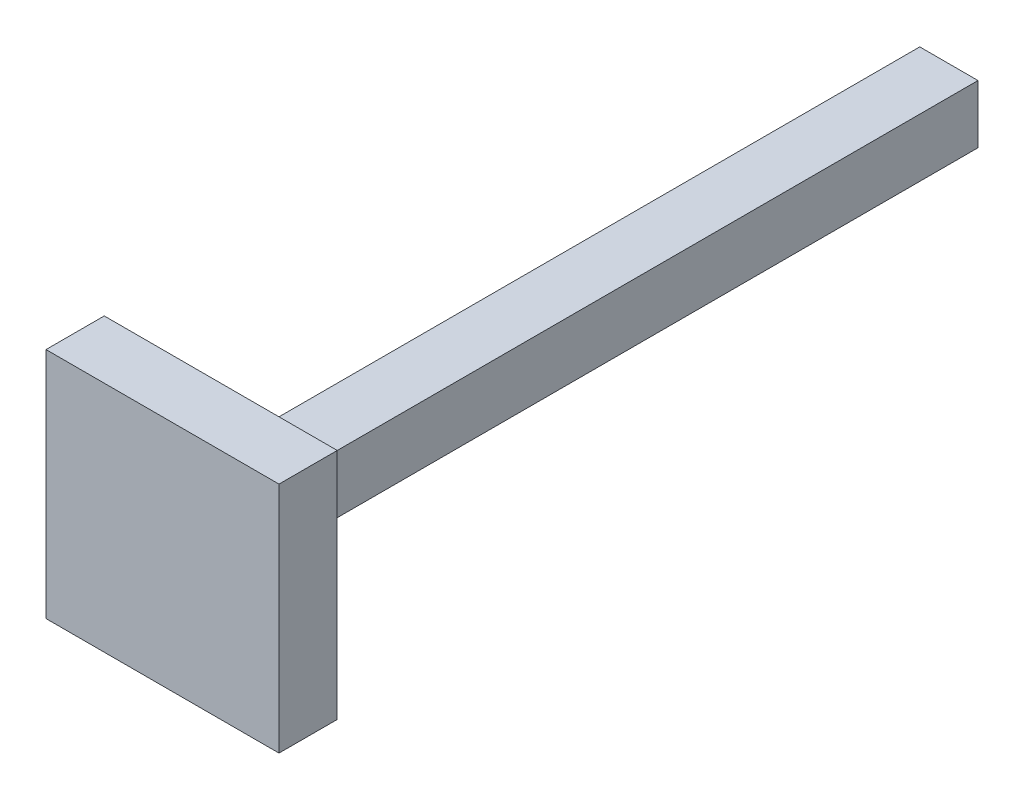
ISO-10303-21;
HEADER;
FILE_DESCRIPTION(('STEP AP214'),'2;1');
FILE_NAME('part.step','',(''),(''),'','','');
FILE_SCHEMA(('AUTOMOTIVE_DESIGN { 1 0 10303 214 1 1 1 1 }'));
ENDSEC;
DATA;
#1=APPLICATION_CONTEXT('core data for automotive mechanical design processes');
#2=APPLICATION_PROTOCOL_DEFINITION('international standard','automotive_design',2000,#1);
#3=PRODUCT_CONTEXT('',#1,'mechanical');
#4=PRODUCT('Part','Part','',(#3));
#5=PRODUCT_RELATED_PRODUCT_CATEGORY('part','',(#4));
#6=PRODUCT_DEFINITION_FORMATION('','',#4);
#7=PRODUCT_DEFINITION_CONTEXT('part definition',#1,'design');
#8=PRODUCT_DEFINITION('design','',#6,#7);
#9=PRODUCT_DEFINITION_SHAPE('','',#8);
#10=(LENGTH_UNIT() NAMED_UNIT(*) SI_UNIT(.MILLI.,.METRE.));
#11=(NAMED_UNIT(*) PLANE_ANGLE_UNIT() SI_UNIT($,.RADIAN.));
#12=(NAMED_UNIT(*) SI_UNIT($,.STERADIAN.) SOLID_ANGLE_UNIT());
#13=UNCERTAINTY_MEASURE_WITH_UNIT(LENGTH_MEASURE(1.E-05),#10,'distance_accuracy_value','');
#14=(GEOMETRIC_REPRESENTATION_CONTEXT(3) GLOBAL_UNCERTAINTY_ASSIGNED_CONTEXT((#13)) GLOBAL_UNIT_ASSIGNED_CONTEXT((#10,
#11,#12)) REPRESENTATION_CONTEXT('',''));
#15=CARTESIAN_POINT('',(0.,0.,0.));
#16=DIRECTION('',(0.,0.,1.));
#17=DIRECTION('',(1.,0.,0.));
#18=AXIS2_PLACEMENT_3D('',#15,#16,#17);
#19=CARTESIAN_POINT('',(25.41,-0.00999999999999889,0.));
#20=DIRECTION('',(0.,0.,-1.));
#21=DIRECTION('',(-1.,0.,0.));
#22=AXIS2_PLACEMENT_3D('',#19,#20,#21);
#23=PLANE('',#22);
#24=DIRECTION('',(-1.,0.,0.));
#25=VECTOR('',#24,1.);
#26=CARTESIAN_POINT('',(12.7,25.4,0.));
#27=LINE('',#26,#25);
#28=CARTESIAN_POINT('',(25.4,25.4,0.));
#29=VERTEX_POINT('',#28);
#30=CARTESIAN_POINT('',(0.,25.4,0.));
#31=VERTEX_POINT('',#30);
#32=EDGE_CURVE('E76',#29,#31,#27,.T.);
#33=ORIENTED_EDGE('',*,*,#32,.F.);
#34=DIRECTION('',(0.,1.,0.));
#35=VECTOR('',#34,1.);
#36=CARTESIAN_POINT('',(25.4,12.7,0.));
#37=LINE('',#36,#35);
#38=CARTESIAN_POINT('',(25.4,0.,0.));
#39=VERTEX_POINT('',#38);
#40=EDGE_CURVE('E21',#39,#29,#37,.T.);
#41=ORIENTED_EDGE('',*,*,#40,.F.);
#42=DIRECTION('',(1.,0.,0.));
#43=VECTOR('',#42,1.);
#44=CARTESIAN_POINT('',(50.8,0.,0.));
#45=LINE('',#44,#43);
#46=CARTESIAN_POINT('',(0.,0.,0.));
#47=VERTEX_POINT('',#46);
#48=EDGE_CURVE('E110',#47,#39,#45,.T.);
#49=ORIENTED_EDGE('',*,*,#48,.F.);
#50=DIRECTION('',(0.,-1.,0.));
#51=VECTOR('',#50,1.);
#52=CARTESIAN_POINT('',(0.,50.8,0.));
#53=LINE('',#52,#51);
#54=EDGE_CURVE('E74',#31,#47,#53,.T.);
#55=ORIENTED_EDGE('',*,*,#54,.F.);
#56=EDGE_LOOP('',(#33,#41,#49,#55));
#57=FACE_BOUND('',#56,.T.);
#58=ADVANCED_FACE('F17',(#57),#23,.T.);
#59=CARTESIAN_POINT('',(-0.0100000000000211,-0.0100000000000033,381.));
#60=DIRECTION('',(0.,0.,1.));
#61=DIRECTION('',(1.,0.,0.));
#62=AXIS2_PLACEMENT_3D('',#59,#60,#61);
#63=PLANE('',#62);
#64=DIRECTION('',(1.,0.,0.));
#65=VECTOR('',#64,1.);
#66=CARTESIAN_POINT('',(50.8,101.6,381.));
#67=LINE('',#66,#65);
#68=CARTESIAN_POINT('',(0.,101.6,381.));
#69=VERTEX_POINT('',#68);
#70=CARTESIAN_POINT('',(101.6,101.6,381.));
#71=VERTEX_POINT('',#70);
#72=EDGE_CURVE('E103',#69,#71,#67,.T.);
#73=ORIENTED_EDGE('',*,*,#72,.F.);
#74=DIRECTION('',(0.,1.,0.));
#75=VECTOR('',#74,1.);
#76=CARTESIAN_POINT('',(0.,50.8,381.));
#77=LINE('',#76,#75);
#78=CARTESIAN_POINT('',(0.,0.,381.));
#79=VERTEX_POINT('',#78);
#80=EDGE_CURVE('E94',#79,#69,#77,.T.);
#81=ORIENTED_EDGE('',*,*,#80,.F.);
#82=DIRECTION('',(-1.,0.,0.));
#83=VECTOR('',#82,1.);
#84=CARTESIAN_POINT('',(50.8,0.,381.));
#85=LINE('',#84,#83);
#86=CARTESIAN_POINT('',(101.6,0.,381.));
#87=VERTEX_POINT('',#86);
#88=EDGE_CURVE('E114',#87,#79,#85,.T.);
#89=ORIENTED_EDGE('',*,*,#88,.F.);
#90=DIRECTION('',(0.,-1.,0.));
#91=VECTOR('',#90,1.);
#92=CARTESIAN_POINT('',(101.6,50.8,381.));
#93=LINE('',#92,#91);
#94=EDGE_CURVE('E108',#71,#87,#93,.T.);
#95=ORIENTED_EDGE('',*,*,#94,.F.);
#96=EDGE_LOOP('',(#73,#81,#89,#95));
#97=FACE_BOUND('',#96,.T.);
#98=ADVANCED_FACE('F139',(#97),#63,.T.);
#99=CARTESIAN_POINT('',(25.4,-0.01,-0.01));
#100=DIRECTION('',(1.,0.,0.));
#101=DIRECTION('',(0.,1.,0.));
#102=AXIS2_PLACEMENT_3D('',#99,#100,#101);
#103=PLANE('',#102);
#104=DIRECTION('',(0.,1.,0.));
#105=VECTOR('',#104,1.);
#106=CARTESIAN_POINT('',(25.4,50.8,355.6));
#107=LINE('',#106,#105);
#108=CARTESIAN_POINT('',(25.4,0.,355.6));
#109=VERTEX_POINT('',#108);
#110=CARTESIAN_POINT('',(25.4,25.4,355.6));
#111=VERTEX_POINT('',#110);
#112=EDGE_CURVE('E120',#109,#111,#107,.T.);
#113=ORIENTED_EDGE('',*,*,#112,.F.);
#114=DIRECTION('',(0.,0.,1.));
#115=VECTOR('',#114,1.);
#116=CARTESIAN_POINT('',(25.4,0.,190.5));
#117=LINE('',#116,#115);
#118=EDGE_CURVE('E87',#39,#109,#117,.T.);
#119=ORIENTED_EDGE('',*,*,#118,.F.);
#120=ORIENTED_EDGE('',*,*,#40,.T.);
#121=DIRECTION('',(0.,0.,-1.));
#122=VECTOR('',#121,1.);
#123=CARTESIAN_POINT('',(25.4,25.4,177.8));
#124=LINE('',#123,#122);
#125=EDGE_CURVE('E82',#111,#29,#124,.T.);
#126=ORIENTED_EDGE('',*,*,#125,.F.);
#127=EDGE_LOOP('',(#113,#119,#120,#126));
#128=FACE_BOUND('',#127,.T.);
#129=ADVANCED_FACE('F84',(#128),#103,.T.);
#130=CARTESIAN_POINT('',(25.41,25.4,-0.01));
#131=DIRECTION('',(0.,1.,0.));
#132=DIRECTION('',(-1.,0.,0.));
#133=AXIS2_PLACEMENT_3D('',#130,#131,#132);
#134=PLANE('',#133);
#135=DIRECTION('',(-1.,0.,0.));
#136=VECTOR('',#135,1.);
#137=CARTESIAN_POINT('',(50.8,25.4,355.6));
#138=LINE('',#137,#136);
#139=CARTESIAN_POINT('',(0.,25.4,355.6));
#140=VERTEX_POINT('',#139);
#141=EDGE_CURVE('E91',#111,#140,#138,.T.);
#142=ORIENTED_EDGE('',*,*,#141,.F.);
#143=ORIENTED_EDGE('',*,*,#125,.T.);
#144=ORIENTED_EDGE('',*,*,#32,.T.);
#145=DIRECTION('',(0.,0.,-1.));
#146=VECTOR('',#145,1.);
#147=CARTESIAN_POINT('',(0.,25.4,190.5));
#148=LINE('',#147,#146);
#149=EDGE_CURVE('E98',#140,#31,#148,.T.);
#150=ORIENTED_EDGE('',*,*,#149,.F.);
#151=EDGE_LOOP('',(#142,#143,#144,#150));
#152=FACE_BOUND('',#151,.T.);
#153=ADVANCED_FACE('F89',(#152),#134,.T.);
#154=CARTESIAN_POINT('',(0.,101.61,-0.01));
#155=DIRECTION('',(-1.,0.,0.));
#156=DIRECTION('',(0.,-1.,0.));
#157=AXIS2_PLACEMENT_3D('',#154,#155,#156);
#158=PLANE('',#157);
#159=DIRECTION('',(0.,1.,0.));
#160=VECTOR('',#159,1.);
#161=CARTESIAN_POINT('',(0.,50.8,355.6));
#162=LINE('',#161,#160);
#163=CARTESIAN_POINT('',(0.,101.6,355.6));
#164=VERTEX_POINT('',#163);
#165=EDGE_CURVE('E123',#140,#164,#162,.T.);
#166=ORIENTED_EDGE('',*,*,#165,.F.);
#167=ORIENTED_EDGE('',*,*,#149,.T.);
#168=ORIENTED_EDGE('',*,*,#54,.T.);
#169=DIRECTION('',(0.,0.,-1.));
#170=VECTOR('',#169,1.);
#171=CARTESIAN_POINT('',(0.,0.,190.5));
#172=LINE('',#171,#170);
#173=EDGE_CURVE('E117',#79,#47,#172,.T.);
#174=ORIENTED_EDGE('',*,*,#173,.F.);
#175=ORIENTED_EDGE('',*,*,#80,.T.);
#176=DIRECTION('',(0.,0.,1.));
#177=VECTOR('',#176,1.);
#178=CARTESIAN_POINT('',(0.,101.6,368.3));
#179=LINE('',#178,#177);
#180=EDGE_CURVE('E100',#164,#69,#179,.T.);
#181=ORIENTED_EDGE('',*,*,#180,.F.);
#182=EDGE_LOOP('',(#166,#167,#168,#174,#175,#181));
#183=FACE_BOUND('',#182,.T.);
#184=ADVANCED_FACE('F145',(#183),#158,.T.);
#185=CARTESIAN_POINT('',(101.61,101.6,355.59));
#186=DIRECTION('',(0.,1.,0.));
#187=DIRECTION('',(-1.,0.,0.));
#188=AXIS2_PLACEMENT_3D('',#185,#186,#187);
#189=PLANE('',#188);
#190=ORIENTED_EDGE('',*,*,#72,.T.);
#191=DIRECTION('',(0.,0.,1.));
#192=VECTOR('',#191,1.);
#193=CARTESIAN_POINT('',(101.6,101.6,368.3));
#194=LINE('',#193,#192);
#195=CARTESIAN_POINT('',(101.6,101.6,355.6));
#196=VERTEX_POINT('',#195);
#197=EDGE_CURVE('E105',#196,#71,#194,.T.);
#198=ORIENTED_EDGE('',*,*,#197,.F.);
#199=DIRECTION('',(1.,0.,0.));
#200=VECTOR('',#199,1.);
#201=CARTESIAN_POINT('',(50.8,101.6,355.6));
#202=LINE('',#201,#200);
#203=EDGE_CURVE('E126',#164,#196,#202,.T.);
#204=ORIENTED_EDGE('',*,*,#203,.F.);
#205=ORIENTED_EDGE('',*,*,#180,.T.);
#206=EDGE_LOOP('',(#190,#198,#204,#205));
#207=FACE_BOUND('',#206,.T.);
#208=ADVANCED_FACE('F136',(#207),#189,.T.);
#209=CARTESIAN_POINT('',(101.6,-0.01,355.59));
#210=DIRECTION('',(1.,0.,0.));
#211=DIRECTION('',(0.,1.,0.));
#212=AXIS2_PLACEMENT_3D('',#209,#210,#211);
#213=PLANE('',#212);
#214=ORIENTED_EDGE('',*,*,#94,.T.);
#215=DIRECTION('',(0.,0.,1.));
#216=VECTOR('',#215,1.);
#217=CARTESIAN_POINT('',(101.6,0.,190.5));
#218=LINE('',#217,#216);
#219=CARTESIAN_POINT('',(101.6,0.,355.6));
#220=VERTEX_POINT('',#219);
#221=EDGE_CURVE('E36',#220,#87,#218,.T.);
#222=ORIENTED_EDGE('',*,*,#221,.F.);
#223=DIRECTION('',(0.,-1.,0.));
#224=VECTOR('',#223,1.);
#225=CARTESIAN_POINT('',(101.6,50.8,355.6));
#226=LINE('',#225,#224);
#227=EDGE_CURVE('E27',#196,#220,#226,.T.);
#228=ORIENTED_EDGE('',*,*,#227,.F.);
#229=ORIENTED_EDGE('',*,*,#197,.T.);
#230=EDGE_LOOP('',(#214,#222,#228,#229));
#231=FACE_BOUND('',#230,.T.);
#232=ADVANCED_FACE('F132',(#231),#213,.T.);
#233=CARTESIAN_POINT('',(-0.01,0.,-0.01));
#234=DIRECTION('',(0.,-1.,0.));
#235=DIRECTION('',(1.,0.,0.));
#236=AXIS2_PLACEMENT_3D('',#233,#234,#235);
#237=PLANE('',#236);
#238=ORIENTED_EDGE('',*,*,#88,.T.);
#239=ORIENTED_EDGE('',*,*,#173,.T.);
#240=ORIENTED_EDGE('',*,*,#48,.T.);
#241=ORIENTED_EDGE('',*,*,#118,.T.);
#242=DIRECTION('',(-1.,0.,0.));
#243=VECTOR('',#242,1.);
#244=CARTESIAN_POINT('',(50.8,0.,355.6));
#245=LINE('',#244,#243);
#246=EDGE_CURVE('E11',#220,#109,#245,.T.);
#247=ORIENTED_EDGE('',*,*,#246,.F.);
#248=ORIENTED_EDGE('',*,*,#221,.T.);
#249=EDGE_LOOP('',(#238,#239,#240,#241,#247,#248));
#250=FACE_BOUND('',#249,.T.);
#251=ADVANCED_FACE('F142',(#250),#237,.T.);
#252=CARTESIAN_POINT('',(101.61,-0.0100000000000033,355.6));
#253=DIRECTION('',(0.,0.,-1.));
#254=DIRECTION('',(-1.,0.,0.));
#255=AXIS2_PLACEMENT_3D('',#252,#253,#254);
#256=PLANE('',#255);
#257=ORIENTED_EDGE('',*,*,#227,.T.);
#258=ORIENTED_EDGE('',*,*,#246,.T.);
#259=ORIENTED_EDGE('',*,*,#112,.T.);
#260=ORIENTED_EDGE('',*,*,#141,.T.);
#261=ORIENTED_EDGE('',*,*,#165,.T.);
#262=ORIENTED_EDGE('',*,*,#203,.T.);
#263=EDGE_LOOP('',(#257,#258,#259,#260,#261,#262));
#264=FACE_BOUND('',#263,.T.);
#265=ADVANCED_FACE('F19',(#264),#256,.T.);
#266=CLOSED_SHELL('',(#58,#98,#129,#153,#184,#208,#232,#251,#265));
#267=MANIFOLD_SOLID_BREP('B1',#266);
#268=ADVANCED_BREP_SHAPE_REPRESENTATION('',(#18,#267),#14);
#269=SHAPE_DEFINITION_REPRESENTATION(#9,#268);
ENDSEC;
END-ISO-10303-21;
